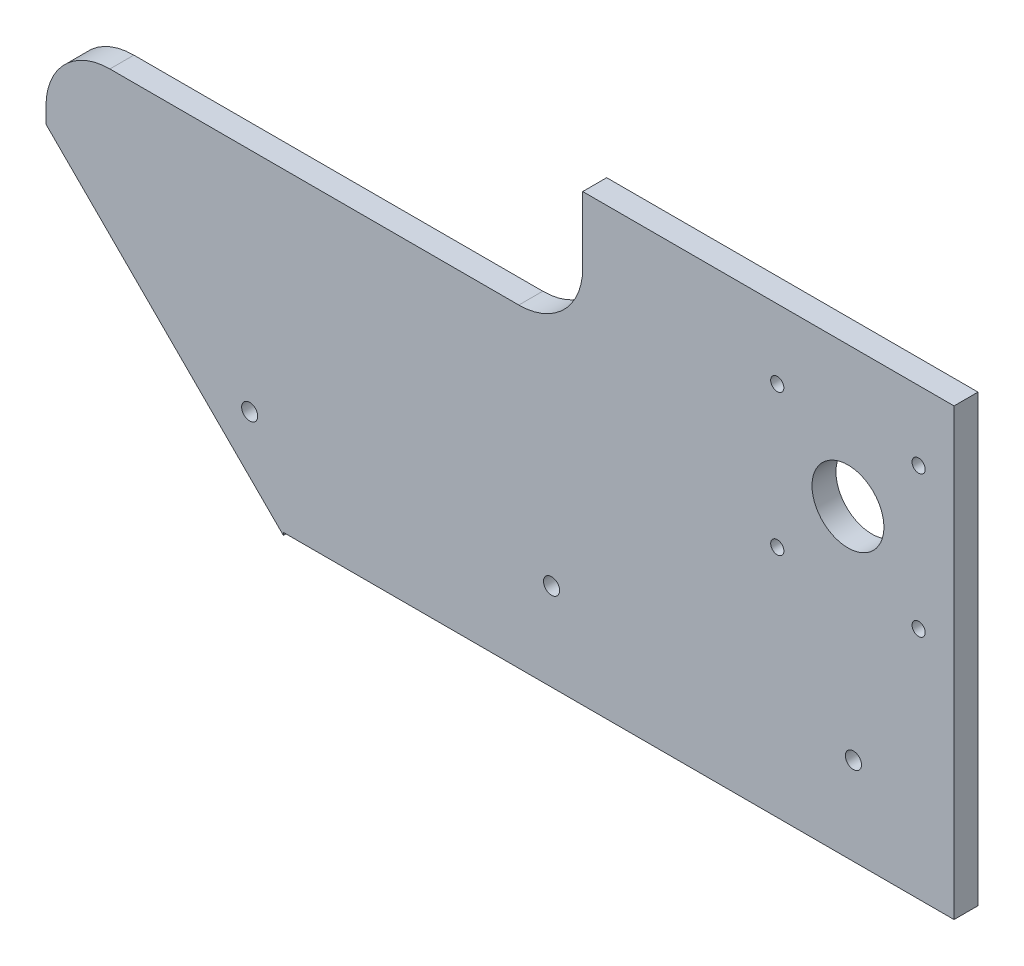
ISO-10303-21;
HEADER;
FILE_DESCRIPTION(('STEP AP214'),'2;1');
FILE_NAME('part.step','',(''),(''),'','','');
FILE_SCHEMA(('AUTOMOTIVE_DESIGN { 1 0 10303 214 1 1 1 1 }'));
ENDSEC;
DATA;
#1=APPLICATION_CONTEXT('core data for automotive mechanical design processes');
#2=APPLICATION_PROTOCOL_DEFINITION('international standard','automotive_design',2000,#1);
#3=PRODUCT_CONTEXT('',#1,'mechanical');
#4=PRODUCT('Part','Part','',(#3));
#5=PRODUCT_RELATED_PRODUCT_CATEGORY('part','',(#4));
#6=PRODUCT_DEFINITION_FORMATION('','',#4);
#7=PRODUCT_DEFINITION_CONTEXT('part definition',#1,'design');
#8=PRODUCT_DEFINITION('design','',#6,#7);
#9=PRODUCT_DEFINITION_SHAPE('','',#8);
#10=(LENGTH_UNIT() NAMED_UNIT(*) SI_UNIT(.MILLI.,.METRE.));
#11=(NAMED_UNIT(*) PLANE_ANGLE_UNIT() SI_UNIT($,.RADIAN.));
#12=(NAMED_UNIT(*) SI_UNIT($,.STERADIAN.) SOLID_ANGLE_UNIT());
#13=UNCERTAINTY_MEASURE_WITH_UNIT(LENGTH_MEASURE(1.E-05),#10,'distance_accuracy_value','');
#14=(GEOMETRIC_REPRESENTATION_CONTEXT(3) GLOBAL_UNCERTAINTY_ASSIGNED_CONTEXT((#13)) GLOBAL_UNIT_ASSIGNED_CONTEXT((#10,
#11,#12)) REPRESENTATION_CONTEXT('',''));
#15=CARTESIAN_POINT('',(0.,0.,0.));
#16=DIRECTION('',(0.,0.,1.));
#17=DIRECTION('',(1.,0.,0.));
#18=AXIS2_PLACEMENT_3D('',#15,#16,#17);
#19=CARTESIAN_POINT('',(0.,0.,9.525));
#20=DIRECTION('',(0.,0.,-1.));
#21=DIRECTION('',(-1.,0.,0.));
#22=AXIS2_PLACEMENT_3D('',#19,#20,#21);
#23=PLANE('',#22);
#24=CARTESIAN_POINT('',(-57.289372205593,-9.46452425694516,9.525));
#25=DIRECTION('',(0.,0.,1.));
#26=DIRECTION('',(1.,0.,0.));
#27=AXIS2_PLACEMENT_3D('',#24,#25,#26);
#28=CIRCLE('',#27,3.2);
#29=CARTESIAN_POINT('',(-54.089372205593,-9.46452425694516,9.525));
#30=VERTEX_POINT('',#29);
#31=EDGE_CURVE('E303',#30,#30,#28,.T.);
#32=ORIENTED_EDGE('',*,*,#31,.F.);
#33=EDGE_LOOP('',(#32));
#34=FACE_BOUND('',#33,.T.);
#35=CARTESIAN_POINT('',(62.710627794407,-9.46452425694516,9.525));
#36=DIRECTION('',(0.,0.,1.));
#37=DIRECTION('',(1.,0.,0.));
#38=AXIS2_PLACEMENT_3D('',#35,#36,#37);
#39=CIRCLE('',#38,3.19999999999999);
#40=CARTESIAN_POINT('',(65.910627794407,-9.46452425694516,9.525));
#41=VERTEX_POINT('',#40);
#42=EDGE_CURVE('E305',#41,#41,#39,.T.);
#43=ORIENTED_EDGE('',*,*,#42,.F.);
#44=EDGE_LOOP('',(#43));
#45=FACE_BOUND('',#44,.T.);
#46=CARTESIAN_POINT('',(182.710627794407,-9.46452425694516,9.525));
#47=DIRECTION('',(0.,0.,1.));
#48=DIRECTION('',(1.,0.,0.));
#49=AXIS2_PLACEMENT_3D('',#46,#47,#48);
#50=CIRCLE('',#49,3.20000000000001);
#51=CARTESIAN_POINT('',(185.910627794407,-9.46452425694516,9.525));
#52=VERTEX_POINT('',#51);
#53=EDGE_CURVE('E313',#52,#52,#50,.T.);
#54=ORIENTED_EDGE('',*,*,#53,.F.);
#55=EDGE_LOOP('',(#54));
#56=FACE_BOUND('',#55,.T.);
#57=CARTESIAN_POINT('',(208.638014077675,104.931975743054,9.525));
#58=DIRECTION('',(0.,0.,1.));
#59=DIRECTION('',(1.,0.,0.));
#60=AXIS2_PLACEMENT_3D('',#57,#58,#59);
#61=CIRCLE('',#60,2.62499999999999);
#62=CARTESIAN_POINT('',(211.263014077675,104.931975743054,9.525));
#63=VERTEX_POINT('',#62);
#64=EDGE_CURVE('E319',#63,#63,#61,.T.);
#65=ORIENTED_EDGE('',*,*,#64,.F.);
#66=EDGE_LOOP('',(#65));
#67=FACE_BOUND('',#66,.T.);
#68=CARTESIAN_POINT('',(152.438014077675,104.931975743054,9.525));
#69=DIRECTION('',(0.,0.,1.));
#70=DIRECTION('',(1.,0.,0.));
#71=AXIS2_PLACEMENT_3D('',#68,#69,#70);
#72=CIRCLE('',#71,2.62499999999999);
#73=CARTESIAN_POINT('',(155.063014077675,104.931975743054,9.525));
#74=VERTEX_POINT('',#73);
#75=EDGE_CURVE('E325',#74,#74,#72,.T.);
#76=ORIENTED_EDGE('',*,*,#75,.F.);
#77=EDGE_LOOP('',(#76));
#78=FACE_BOUND('',#77,.T.);
#79=CARTESIAN_POINT('',(152.438014077675,48.7319757430537,9.525));
#80=DIRECTION('',(0.,0.,1.));
#81=DIRECTION('',(1.,0.,0.));
#82=AXIS2_PLACEMENT_3D('',#79,#80,#81);
#83=CIRCLE('',#82,2.62499999999999);
#84=CARTESIAN_POINT('',(155.063014077675,48.7319757430537,9.525));
#85=VERTEX_POINT('',#84);
#86=EDGE_CURVE('E331',#85,#85,#83,.T.);
#87=ORIENTED_EDGE('',*,*,#86,.F.);
#88=EDGE_LOOP('',(#87));
#89=FACE_BOUND('',#88,.T.);
#90=CARTESIAN_POINT('',(208.638014077675,48.7319757430537,9.525));
#91=DIRECTION('',(0.,0.,1.));
#92=DIRECTION('',(1.,0.,0.));
#93=AXIS2_PLACEMENT_3D('',#90,#91,#92);
#94=CIRCLE('',#93,2.62499999999999);
#95=CARTESIAN_POINT('',(211.263014077675,48.7319757430537,9.525));
#96=VERTEX_POINT('',#95);
#97=EDGE_CURVE('E258',#96,#96,#94,.T.);
#98=ORIENTED_EDGE('',*,*,#97,.F.);
#99=EDGE_LOOP('',(#98));
#100=FACE_BOUND('',#99,.T.);
#101=CARTESIAN_POINT('',(180.538014077675,76.8319757430537,9.525));
#102=DIRECTION('',(0.,0.,1.));
#103=DIRECTION('',(1.,0.,0.));
#104=AXIS2_PLACEMENT_3D('',#101,#102,#103);
#105=CIRCLE('',#104,14.2875);
#106=CARTESIAN_POINT('',(166.250514077675,76.8319757430537,9.525));
#107=VERTEX_POINT('',#106);
#108=EDGE_CURVE('E145',#107,#107,#105,.T.);
#109=ORIENTED_EDGE('',*,*,#108,.F.);
#110=EDGE_LOOP('',(#109));
#111=FACE_BOUND('',#110,.T.);
#112=DIRECTION('',(0.,1.,0.));
#113=VECTOR('',#112,1.);
#114=CARTESIAN_POINT('',(222.710627804405,-121.478524256948,9.525));
#115=LINE('',#114,#113);
#116=CARTESIAN_POINT('',(222.710627804405,-44.3221747391824,9.525));
#117=VERTEX_POINT('',#116);
#118=CARTESIAN_POINT('',(222.710627804405,132.521475743053,9.525));
#119=VERTEX_POINT('',#118);
#120=EDGE_CURVE('E122',#117,#119,#115,.T.);
#121=ORIENTED_EDGE('',*,*,#120,.T.);
#122=DIRECTION('',(-1.,0.,0.));
#123=VECTOR('',#122,1.);
#124=CARTESIAN_POINT('',(75.1006165261018,132.521475743053,9.525));
#125=LINE('',#124,#123);
#126=CARTESIAN_POINT('',(75.1006165261018,132.521475743053,9.525));
#127=VERTEX_POINT('',#126);
#128=EDGE_CURVE('E108',#119,#127,#125,.T.);
#129=ORIENTED_EDGE('',*,*,#128,.T.);
#130=DIRECTION('',(0.,-1.,0.));
#131=VECTOR('',#130,1.);
#132=CARTESIAN_POINT('',(75.1006165261018,146.206839025053,9.525));
#133=LINE('',#132,#131);
#134=CARTESIAN_POINT('',(75.1006165261018,106.141487021357,9.525));
#135=VERTEX_POINT('',#134);
#136=EDGE_CURVE('E169',#127,#135,#133,.T.);
#137=ORIENTED_EDGE('',*,*,#136,.T.);
#138=CARTESIAN_POINT('',(49.7006165261018,106.141487021357,9.525));
#139=DIRECTION('',(0.,0.,-1.));
#140=DIRECTION('',(-1.,0.,0.));
#141=AXIS2_PLACEMENT_3D('',#138,#139,#140);
#142=CIRCLE('',#141,25.4);
#143=CARTESIAN_POINT('',(49.7006165261019,80.7414870213568,9.525));
#144=VERTEX_POINT('',#143);
#145=EDGE_CURVE('E41',#135,#144,#142,.T.);
#146=ORIENTED_EDGE('',*,*,#145,.T.);
#147=DIRECTION('',(1.,0.,0.));
#148=VECTOR('',#147,1.);
#149=CARTESIAN_POINT('',(-138.259383473898,80.7414870213568,9.525));
#150=LINE('',#149,#148);
#151=CARTESIAN_POINT('',(-112.859383473898,80.7414870213568,9.525));
#152=VERTEX_POINT('',#151);
#153=EDGE_CURVE('E168',#152,#144,#150,.T.);
#154=ORIENTED_EDGE('',*,*,#153,.F.);
#155=CARTESIAN_POINT('',(-112.859383473898,55.3414870213568,9.525));
#156=DIRECTION('',(0.,0.,-1.));
#157=DIRECTION('',(-1.,0.,0.));
#158=AXIS2_PLACEMENT_3D('',#155,#156,#157);
#159=CIRCLE('',#158,25.4);
#160=CARTESIAN_POINT('',(-138.259383473898,55.3414870213568,9.525));
#161=VERTEX_POINT('',#160);
#162=EDGE_CURVE('E158',#152,#161,#159,.F.);
#163=ORIENTED_EDGE('',*,*,#162,.T.);
#164=DIRECTION('',(0.,-1.,0.));
#165=VECTOR('',#164,1.);
#166=CARTESIAN_POINT('',(-138.259383473898,146.206839025053,9.525));
#167=LINE('',#166,#165);
#168=CARTESIAN_POINT('',(-138.259383473898,48.9914870213571,9.525));
#169=VERTEX_POINT('',#168);
#170=EDGE_CURVE('E129',#161,#169,#167,.T.);
#171=ORIENTED_EDGE('',*,*,#170,.T.);
#172=DIRECTION('',(0.707106781186546,-0.707106781186549,0.));
#173=VECTOR('',#172,1.);
#174=CARTESIAN_POINT('',(-138.259383473898,48.9914870213571,9.525));
#175=LINE('',#174,#173);
#176=CARTESIAN_POINT('',(-43.8795997738897,-45.3882966786511,9.525));
#177=VERTEX_POINT('',#176);
#178=EDGE_CURVE('E132',#169,#177,#175,.T.);
#179=ORIENTED_EDGE('',*,*,#178,.T.);
#180=DIRECTION('',(0.,1.,0.));
#181=VECTOR('',#180,1.);
#182=CARTESIAN_POINT('',(-43.8795997738897,-121.478524256947,9.525));
#183=LINE('',#182,#181);
#184=CARTESIAN_POINT('',(-43.8795997738897,-44.3221747391824,9.525));
#185=VERTEX_POINT('',#184);
#186=EDGE_CURVE('E195',#177,#185,#183,.T.);
#187=ORIENTED_EDGE('',*,*,#186,.T.);
#188=DIRECTION('',(-1.,0.,0.));
#189=VECTOR('',#188,1.);
#190=CARTESIAN_POINT('',(241.760627804405,-44.3221747391824,9.525));
#191=LINE('',#190,#189);
#192=EDGE_CURVE('E128',#117,#185,#191,.T.);
#193=ORIENTED_EDGE('',*,*,#192,.F.);
#194=EDGE_LOOP('',(#121,#129,#137,#146,#154,#163,#171,#179,#187,#193));
#195=FACE_BOUND('',#194,.T.);
#196=ADVANCED_FACE('F33',(#34,#45,#56,#67,#78,#89,#100,#111,#195),#23,.F.);
#197=CARTESIAN_POINT('',(0.,0.,0.));
#198=DIRECTION('',(0.,0.,-1.));
#199=DIRECTION('',(-1.,0.,0.));
#200=AXIS2_PLACEMENT_3D('',#197,#198,#199);
#201=PLANE('',#200);
#202=CARTESIAN_POINT('',(-57.289372205593,-9.46452425694516,0.));
#203=DIRECTION('',(0.,0.,1.));
#204=DIRECTION('',(1.,0.,0.));
#205=AXIS2_PLACEMENT_3D('',#202,#203,#204);
#206=CIRCLE('',#205,3.19999999999999);
#207=CARTESIAN_POINT('',(-54.089372205593,-9.46452425694516,0.));
#208=VERTEX_POINT('',#207);
#209=EDGE_CURVE('E301',#208,#208,#206,.T.);
#210=ORIENTED_EDGE('',*,*,#209,.T.);
#211=EDGE_LOOP('',(#210));
#212=FACE_BOUND('',#211,.T.);
#213=CARTESIAN_POINT('',(62.710627794407,-9.46452425694516,0.));
#214=DIRECTION('',(0.,0.,1.));
#215=DIRECTION('',(1.,0.,0.));
#216=AXIS2_PLACEMENT_3D('',#213,#214,#215);
#217=CIRCLE('',#216,3.19999999999999);
#218=CARTESIAN_POINT('',(65.910627794407,-9.46452425694516,0.));
#219=VERTEX_POINT('',#218);
#220=EDGE_CURVE('E310',#219,#219,#217,.T.);
#221=ORIENTED_EDGE('',*,*,#220,.T.);
#222=EDGE_LOOP('',(#221));
#223=FACE_BOUND('',#222,.T.);
#224=CARTESIAN_POINT('',(182.710627794407,-9.46452425694516,0.));
#225=DIRECTION('',(0.,0.,1.));
#226=DIRECTION('',(1.,0.,0.));
#227=AXIS2_PLACEMENT_3D('',#224,#225,#226);
#228=CIRCLE('',#227,3.20000000000001);
#229=CARTESIAN_POINT('',(185.910627794407,-9.46452425694516,0.));
#230=VERTEX_POINT('',#229);
#231=EDGE_CURVE('E316',#230,#230,#228,.T.);
#232=ORIENTED_EDGE('',*,*,#231,.T.);
#233=EDGE_LOOP('',(#232));
#234=FACE_BOUND('',#233,.T.);
#235=CARTESIAN_POINT('',(208.638014077675,104.931975743054,0.));
#236=DIRECTION('',(0.,0.,1.));
#237=DIRECTION('',(1.,0.,0.));
#238=AXIS2_PLACEMENT_3D('',#235,#236,#237);
#239=CIRCLE('',#238,2.62499999999999);
#240=CARTESIAN_POINT('',(211.263014077675,104.931975743054,0.));
#241=VERTEX_POINT('',#240);
#242=EDGE_CURVE('E322',#241,#241,#239,.T.);
#243=ORIENTED_EDGE('',*,*,#242,.T.);
#244=EDGE_LOOP('',(#243));
#245=FACE_BOUND('',#244,.T.);
#246=CARTESIAN_POINT('',(152.438014077675,104.931975743054,0.));
#247=DIRECTION('',(0.,0.,1.));
#248=DIRECTION('',(1.,0.,0.));
#249=AXIS2_PLACEMENT_3D('',#246,#247,#248);
#250=CIRCLE('',#249,2.62499999999999);
#251=CARTESIAN_POINT('',(155.063014077675,104.931975743054,0.));
#252=VERTEX_POINT('',#251);
#253=EDGE_CURVE('E328',#252,#252,#250,.T.);
#254=ORIENTED_EDGE('',*,*,#253,.T.);
#255=EDGE_LOOP('',(#254));
#256=FACE_BOUND('',#255,.T.);
#257=CARTESIAN_POINT('',(152.438014077675,48.7319757430537,0.));
#258=DIRECTION('',(0.,0.,1.));
#259=DIRECTION('',(1.,0.,0.));
#260=AXIS2_PLACEMENT_3D('',#257,#258,#259);
#261=CIRCLE('',#260,2.62499999999999);
#262=CARTESIAN_POINT('',(155.063014077675,48.7319757430537,0.));
#263=VERTEX_POINT('',#262);
#264=EDGE_CURVE('E334',#263,#263,#261,.T.);
#265=ORIENTED_EDGE('',*,*,#264,.T.);
#266=EDGE_LOOP('',(#265));
#267=FACE_BOUND('',#266,.T.);
#268=CARTESIAN_POINT('',(208.638014077675,48.7319757430537,0.));
#269=DIRECTION('',(0.,0.,1.));
#270=DIRECTION('',(1.,0.,0.));
#271=AXIS2_PLACEMENT_3D('',#268,#269,#270);
#272=CIRCLE('',#271,2.62499999999999);
#273=CARTESIAN_POINT('',(211.263014077675,48.7319757430537,0.));
#274=VERTEX_POINT('',#273);
#275=EDGE_CURVE('E255',#274,#274,#272,.T.);
#276=ORIENTED_EDGE('',*,*,#275,.T.);
#277=EDGE_LOOP('',(#276));
#278=FACE_BOUND('',#277,.T.);
#279=DIRECTION('',(-1.,0.,0.));
#280=VECTOR('',#279,1.);
#281=CARTESIAN_POINT('',(75.1006165261018,132.521475743053,0.));
#282=LINE('',#281,#280);
#283=CARTESIAN_POINT('',(222.710627804405,132.521475743053,0.));
#284=VERTEX_POINT('',#283);
#285=CARTESIAN_POINT('',(75.1006165261018,132.521475743053,0.));
#286=VERTEX_POINT('',#285);
#287=EDGE_CURVE('E48',#284,#286,#282,.T.);
#288=ORIENTED_EDGE('',*,*,#287,.F.);
#289=DIRECTION('',(0.,1.,0.));
#290=VECTOR('',#289,1.);
#291=CARTESIAN_POINT('',(222.710627804405,-121.478524256948,0.));
#292=LINE('',#291,#290);
#293=CARTESIAN_POINT('',(222.710627804405,-44.3221747391824,0.));
#294=VERTEX_POINT('',#293);
#295=EDGE_CURVE('E124',#294,#284,#292,.T.);
#296=ORIENTED_EDGE('',*,*,#295,.F.);
#297=DIRECTION('',(-1.,0.,0.));
#298=VECTOR('',#297,1.);
#299=CARTESIAN_POINT('',(241.760627804405,-44.3221747391824,0.));
#300=LINE('',#299,#298);
#301=CARTESIAN_POINT('',(-43.8795997738897,-44.3221747391824,0.));
#302=VERTEX_POINT('',#301);
#303=EDGE_CURVE('E191',#294,#302,#300,.T.);
#304=ORIENTED_EDGE('',*,*,#303,.T.);
#305=DIRECTION('',(0.,1.,0.));
#306=VECTOR('',#305,1.);
#307=CARTESIAN_POINT('',(-43.8795997738897,-121.478524256947,0.));
#308=LINE('',#307,#306);
#309=CARTESIAN_POINT('',(-43.8795997738897,-45.3882966786512,0.));
#310=VERTEX_POINT('',#309);
#311=EDGE_CURVE('E194',#310,#302,#308,.T.);
#312=ORIENTED_EDGE('',*,*,#311,.F.);
#313=DIRECTION('',(0.707106781186546,-0.707106781186549,0.));
#314=VECTOR('',#313,1.);
#315=CARTESIAN_POINT('',(-138.259383473898,48.9914870213571,0.));
#316=LINE('',#315,#314);
#317=CARTESIAN_POINT('',(-138.259383473898,48.9914870213571,0.));
#318=VERTEX_POINT('',#317);
#319=EDGE_CURVE('E130',#318,#310,#316,.T.);
#320=ORIENTED_EDGE('',*,*,#319,.F.);
#321=DIRECTION('',(0.,-1.,0.));
#322=VECTOR('',#321,1.);
#323=CARTESIAN_POINT('',(-138.259383473898,146.206839025053,0.));
#324=LINE('',#323,#322);
#325=CARTESIAN_POINT('',(-138.259383473898,55.3414870213568,0.));
#326=VERTEX_POINT('',#325);
#327=EDGE_CURVE('E135',#326,#318,#324,.T.);
#328=ORIENTED_EDGE('',*,*,#327,.F.);
#329=CARTESIAN_POINT('',(-112.859383473898,55.3414870213568,0.));
#330=DIRECTION('',(0.,0.,-1.));
#331=DIRECTION('',(-1.,0.,0.));
#332=AXIS2_PLACEMENT_3D('',#329,#330,#331);
#333=CIRCLE('',#332,25.4);
#334=CARTESIAN_POINT('',(-112.859383473898,80.7414870213568,0.));
#335=VERTEX_POINT('',#334);
#336=EDGE_CURVE('E162',#326,#335,#333,.T.);
#337=ORIENTED_EDGE('',*,*,#336,.T.);
#338=DIRECTION('',(1.,0.,0.));
#339=VECTOR('',#338,1.);
#340=CARTESIAN_POINT('',(-138.259383473898,80.7414870213568,0.));
#341=LINE('',#340,#339);
#342=CARTESIAN_POINT('',(49.7006165261019,80.7414870213568,0.));
#343=VERTEX_POINT('',#342);
#344=EDGE_CURVE('E183',#335,#343,#341,.T.);
#345=ORIENTED_EDGE('',*,*,#344,.T.);
#346=CARTESIAN_POINT('',(49.7006165261018,106.141487021357,0.));
#347=DIRECTION('',(0.,0.,-1.));
#348=DIRECTION('',(-1.,0.,0.));
#349=AXIS2_PLACEMENT_3D('',#346,#347,#348);
#350=CIRCLE('',#349,25.4);
#351=CARTESIAN_POINT('',(75.1006165261018,106.141487021357,0.));
#352=VERTEX_POINT('',#351);
#353=EDGE_CURVE('E11',#343,#352,#350,.F.);
#354=ORIENTED_EDGE('',*,*,#353,.T.);
#355=DIRECTION('',(0.,-1.,0.));
#356=VECTOR('',#355,1.);
#357=CARTESIAN_POINT('',(75.1006165261018,146.206839025053,0.));
#358=LINE('',#357,#356);
#359=EDGE_CURVE('E55',#286,#352,#358,.T.);
#360=ORIENTED_EDGE('',*,*,#359,.F.);
#361=EDGE_LOOP('',(#288,#296,#304,#312,#320,#328,#337,#345,#354,#360));
#362=FACE_BOUND('',#361,.T.);
#363=CARTESIAN_POINT('',(180.538014077675,76.8319757430537,0.));
#364=DIRECTION('',(0.,0.,1.));
#365=DIRECTION('',(1.,0.,0.));
#366=AXIS2_PLACEMENT_3D('',#363,#364,#365);
#367=CIRCLE('',#366,14.2875);
#368=CARTESIAN_POINT('',(166.250514077675,76.8319757430537,0.));
#369=VERTEX_POINT('',#368);
#370=EDGE_CURVE('E138',#369,#369,#367,.T.);
#371=ORIENTED_EDGE('',*,*,#370,.T.);
#372=EDGE_LOOP('',(#371));
#373=FACE_BOUND('',#372,.T.);
#374=ADVANCED_FACE('F181',(#212,#223,#234,#245,#256,#267,#278,#362,#373),#201,.T.);
#375=CARTESIAN_POINT('',(-138.259383473898,48.9914870213571,9.525));
#376=DIRECTION('',(0.707106781186549,0.707106781186546,0.));
#377=DIRECTION('',(-0.707106781186546,0.707106781186549,0.));
#378=AXIS2_PLACEMENT_3D('',#375,#376,#377);
#379=PLANE('',#378);
#380=DIRECTION('',(0.,0.,-1.));
#381=VECTOR('',#380,1.);
#382=CARTESIAN_POINT('',(-43.8795997738897,-45.3882966786511,9.525));
#383=LINE('',#382,#381);
#384=EDGE_CURVE('E149',#177,#310,#383,.T.);
#385=ORIENTED_EDGE('',*,*,#384,.F.);
#386=ORIENTED_EDGE('',*,*,#178,.F.);
#387=DIRECTION('',(0.,0.,-1.));
#388=VECTOR('',#387,1.);
#389=CARTESIAN_POINT('',(-138.259383473898,48.9914870213571,9.525));
#390=LINE('',#389,#388);
#391=EDGE_CURVE('E143',#169,#318,#390,.T.);
#392=ORIENTED_EDGE('',*,*,#391,.T.);
#393=ORIENTED_EDGE('',*,*,#319,.T.);
#394=EDGE_LOOP('',(#385,#386,#392,#393));
#395=FACE_BOUND('',#394,.T.);
#396=ADVANCED_FACE('F227',(#395),#379,.F.);
#397=CARTESIAN_POINT('',(222.710627804405,-121.478524256948,9.525));
#398=DIRECTION('',(-1.,0.,0.));
#399=DIRECTION('',(0.,-1.,0.));
#400=AXIS2_PLACEMENT_3D('',#397,#398,#399);
#401=PLANE('',#400);
#402=ORIENTED_EDGE('',*,*,#295,.T.);
#403=DIRECTION('',(0.,0.,-1.));
#404=VECTOR('',#403,1.);
#405=CARTESIAN_POINT('',(222.710627804405,132.521475743053,9.525));
#406=LINE('',#405,#404);
#407=EDGE_CURVE('E111',#119,#284,#406,.T.);
#408=ORIENTED_EDGE('',*,*,#407,.F.);
#409=ORIENTED_EDGE('',*,*,#120,.F.);
#410=DIRECTION('',(0.,0.,-1.));
#411=VECTOR('',#410,1.);
#412=CARTESIAN_POINT('',(222.710627804405,-44.3221747391824,9.525));
#413=LINE('',#412,#411);
#414=EDGE_CURVE('E151',#117,#294,#413,.T.);
#415=ORIENTED_EDGE('',*,*,#414,.T.);
#416=EDGE_LOOP('',(#402,#408,#409,#415));
#417=FACE_BOUND('',#416,.T.);
#418=ADVANCED_FACE('F120',(#417),#401,.F.);
#419=CARTESIAN_POINT('',(-138.259383473898,146.206839025053,9.525));
#420=DIRECTION('',(1.,0.,0.));
#421=DIRECTION('',(0.,0.,-1.));
#422=AXIS2_PLACEMENT_3D('',#419,#420,#421);
#423=PLANE('',#422);
#424=ORIENTED_EDGE('',*,*,#170,.F.);
#425=DIRECTION('',(0.,0.,1.));
#426=VECTOR('',#425,1.);
#427=CARTESIAN_POINT('',(-138.259383473898,55.3414870213568,9.525));
#428=LINE('',#427,#426);
#429=EDGE_CURVE('E160',#161,#326,#428,.F.);
#430=ORIENTED_EDGE('',*,*,#429,.T.);
#431=ORIENTED_EDGE('',*,*,#327,.T.);
#432=ORIENTED_EDGE('',*,*,#391,.F.);
#433=EDGE_LOOP('',(#424,#430,#431,#432));
#434=FACE_BOUND('',#433,.T.);
#435=ADVANCED_FACE('F210',(#434),#423,.F.);
#436=CARTESIAN_POINT('',(180.538014077675,76.8319757430537,9.525));
#437=DIRECTION('',(0.,0.,-1.));
#438=DIRECTION('',(-1.,0.,0.));
#439=AXIS2_PLACEMENT_3D('',#436,#437,#438);
#440=CYLINDRICAL_SURFACE('',#439,14.2875);
#441=CARTESIAN_POINT('',(166.250514077675,76.8319757430537,9.525));
#442=CARTESIAN_POINT('',(166.250514077675,76.8319757430537,9.42578125));
#443=CARTESIAN_POINT('',(166.250514077675,76.8319757430537,9.3265625));
#444=CARTESIAN_POINT('',(166.250514077675,76.8319757430537,9.128125));
#445=CARTESIAN_POINT('',(166.250514077675,76.8319757430537,9.02890625));
#446=CARTESIAN_POINT('',(166.250514077675,76.8319757430537,8.83046875));
#447=CARTESIAN_POINT('',(166.250514077675,76.8319757430537,8.73125));
#448=CARTESIAN_POINT('',(166.250514077675,76.8319757430537,8.5328125));
#449=CARTESIAN_POINT('',(166.250514077675,76.8319757430537,8.43359375));
#450=CARTESIAN_POINT('',(166.250514077675,76.8319757430537,8.23515625));
#451=CARTESIAN_POINT('',(166.250514077675,76.8319757430537,8.1359375));
#452=CARTESIAN_POINT('',(166.250514077675,76.8319757430537,7.9375));
#453=CARTESIAN_POINT('',(166.250514077675,76.8319757430537,7.83828125));
#454=CARTESIAN_POINT('',(166.250514077675,76.8319757430537,7.63984375));
#455=CARTESIAN_POINT('',(166.250514077675,76.8319757430537,7.540625));
#456=CARTESIAN_POINT('',(166.250514077675,76.8319757430537,7.3421875));
#457=CARTESIAN_POINT('',(166.250514077675,76.8319757430537,7.24296875));
#458=CARTESIAN_POINT('',(166.250514077675,76.8319757430537,7.04453125));
#459=CARTESIAN_POINT('',(166.250514077675,76.8319757430537,6.9453125));
#460=CARTESIAN_POINT('',(166.250514077675,76.8319757430537,6.746875));
#461=CARTESIAN_POINT('',(166.250514077675,76.8319757430537,6.64765625));
#462=CARTESIAN_POINT('',(166.250514077675,76.8319757430537,6.44921875));
#463=CARTESIAN_POINT('',(166.250514077675,76.8319757430537,6.35));
#464=CARTESIAN_POINT('',(166.250514077675,76.8319757430537,6.1515625));
#465=CARTESIAN_POINT('',(166.250514077675,76.8319757430537,6.05234375));
#466=CARTESIAN_POINT('',(166.250514077675,76.8319757430537,5.85390625));
#467=CARTESIAN_POINT('',(166.250514077675,76.8319757430537,5.7546875));
#468=CARTESIAN_POINT('',(166.250514077675,76.8319757430537,5.55625));
#469=CARTESIAN_POINT('',(166.250514077675,76.8319757430537,5.45703125));
#470=CARTESIAN_POINT('',(166.250514077675,76.8319757430537,5.25859375));
#471=CARTESIAN_POINT('',(166.250514077675,76.8319757430537,5.159375));
#472=CARTESIAN_POINT('',(166.250514077675,76.8319757430537,4.9609375));
#473=CARTESIAN_POINT('',(166.250514077675,76.8319757430537,4.86171875));
#474=CARTESIAN_POINT('',(166.250514077675,76.8319757430537,4.66328125));
#475=CARTESIAN_POINT('',(166.250514077675,76.8319757430537,4.5640625));
#476=CARTESIAN_POINT('',(166.250514077675,76.8319757430537,4.365625));
#477=CARTESIAN_POINT('',(166.250514077675,76.8319757430537,4.26640625));
#478=CARTESIAN_POINT('',(166.250514077675,76.8319757430537,4.06796875));
#479=CARTESIAN_POINT('',(166.250514077675,76.8319757430537,3.96875));
#480=CARTESIAN_POINT('',(166.250514077675,76.8319757430537,3.7703125));
#481=CARTESIAN_POINT('',(166.250514077675,76.8319757430537,3.67109375));
#482=CARTESIAN_POINT('',(166.250514077675,76.8319757430537,3.47265625));
#483=CARTESIAN_POINT('',(166.250514077675,76.8319757430537,3.3734375));
#484=CARTESIAN_POINT('',(166.250514077675,76.8319757430537,3.175));
#485=CARTESIAN_POINT('',(166.250514077675,76.8319757430537,3.07578125));
#486=CARTESIAN_POINT('',(166.250514077675,76.8319757430537,2.87734375));
#487=CARTESIAN_POINT('',(166.250514077675,76.8319757430537,2.778125));
#488=CARTESIAN_POINT('',(166.250514077675,76.8319757430537,2.5796875));
#489=CARTESIAN_POINT('',(166.250514077675,76.8319757430537,2.48046875));
#490=CARTESIAN_POINT('',(166.250514077675,76.8319757430537,2.28203125));
#491=CARTESIAN_POINT('',(166.250514077675,76.8319757430537,2.1828125));
#492=CARTESIAN_POINT('',(166.250514077675,76.8319757430537,1.984375));
#493=CARTESIAN_POINT('',(166.250514077675,76.8319757430537,1.88515625));
#494=CARTESIAN_POINT('',(166.250514077675,76.8319757430537,1.68671875));
#495=CARTESIAN_POINT('',(166.250514077675,76.8319757430537,1.5875));
#496=CARTESIAN_POINT('',(166.250514077675,76.8319757430537,1.3890625));
#497=CARTESIAN_POINT('',(166.250514077675,76.8319757430537,1.28984375));
#498=CARTESIAN_POINT('',(166.250514077675,76.8319757430537,1.09140625));
#499=CARTESIAN_POINT('',(166.250514077675,76.8319757430537,0.992187500000001));
#500=CARTESIAN_POINT('',(166.250514077675,76.8319757430537,0.793750000000001));
#501=CARTESIAN_POINT('',(166.250514077675,76.8319757430537,0.69453125));
#502=CARTESIAN_POINT('',(166.250514077675,76.8319757430537,0.49609375));
#503=CARTESIAN_POINT('',(166.250514077675,76.8319757430537,0.396875));
#504=CARTESIAN_POINT('',(166.250514077675,76.8319757430537,0.1984375));
#505=CARTESIAN_POINT('',(166.250514077675,76.8319757430537,0.0992187500000001));
#506=CARTESIAN_POINT('',(166.250514077675,76.8319757430537,0.));
#507=B_SPLINE_CURVE_WITH_KNOTS('',3,(#441,#442,#443,#444,#445,#446,#447,#448,#449,#450,#451,
#452,#453,#454,#455,#456,#457,#458,#459,#460,#461,#462,#463,#464,#465,#466,#467,#468,#469,#470,
#471,#472,#473,#474,#475,#476,#477,#478,#479,#480,#481,#482,#483,#484,#485,#486,#487,#488,#489,
#490,#491,#492,#493,#494,#495,#496,#497,#498,#499,#500,#501,#502,#503,#504,#505,#506),
.UNSPECIFIED.,.F.,.F.,(4,2,2,2,2,2,2,2,2,2,2,2,2,2,2,2,2,2,2,2,2,2,2,2,2,2,2,2,2,2,2,2,4),(0.,
0.29765625,0.5953125,0.892968750000001,1.190625,1.48828125,1.7859375,2.08359375,2.38125,
2.67890625,2.9765625,3.27421875,3.571875,3.86953125,4.1671875,4.46484375,4.7625,5.06015625,
5.3578125,5.65546875,5.953125,6.25078125,6.5484375,6.84609375,7.14375,7.44140625,7.7390625,
8.03671875,8.334375,8.63203125,8.9296875,9.22734375,9.525),.UNSPECIFIED.);
#508=EDGE_CURVE('BSEAM207',#107,#369,#507,.T.);
#509=ORIENTED_EDGE('',*,*,#108,.T.);
#510=ORIENTED_EDGE('',*,*,#370,.F.);
#511=ORIENTED_EDGE('',*,*,#508,.T.);
#512=ORIENTED_EDGE('',*,*,#508,.F.);
#513=EDGE_LOOP('',(#509,#511,#510,#512));
#514=FACE_BOUND('',#513,.T.);
#515=ADVANCED_FACE('F207',(#514),#440,.F.);
#516=CARTESIAN_POINT('',(241.760627804405,-44.3221747391824,0.));
#517=DIRECTION('',(0.,1.,0.));
#518=DIRECTION('',(-1.,0.,0.));
#519=AXIS2_PLACEMENT_3D('',#516,#517,#518);
#520=PLANE('',#519);
#521=ORIENTED_EDGE('',*,*,#192,.T.);
#522=DIRECTION('',(0.,0.,1.));
#523=VECTOR('',#522,1.);
#524=CARTESIAN_POINT('',(-43.8795997738897,-44.3221747391824,0.));
#525=LINE('',#524,#523);
#526=EDGE_CURVE('E197',#302,#185,#525,.T.);
#527=ORIENTED_EDGE('',*,*,#526,.F.);
#528=ORIENTED_EDGE('',*,*,#303,.F.);
#529=ORIENTED_EDGE('',*,*,#414,.F.);
#530=EDGE_LOOP('',(#521,#527,#528,#529));
#531=FACE_BOUND('',#530,.T.);
#532=ADVANCED_FACE('F209',(#531),#520,.F.);
#533=CARTESIAN_POINT('',(-43.8795997738897,-121.478524256947,0.));
#534=DIRECTION('',(1.,0.,0.));
#535=DIRECTION('',(0.,0.,-1.));
#536=AXIS2_PLACEMENT_3D('',#533,#534,#535);
#537=PLANE('',#536);
#538=ORIENTED_EDGE('',*,*,#384,.T.);
#539=ORIENTED_EDGE('',*,*,#311,.T.);
#540=ORIENTED_EDGE('',*,*,#526,.T.);
#541=ORIENTED_EDGE('',*,*,#186,.F.);
#542=EDGE_LOOP('',(#538,#539,#540,#541));
#543=FACE_BOUND('',#542,.T.);
#544=ADVANCED_FACE('F216',(#543),#537,.T.);
#545=CARTESIAN_POINT('',(75.1006165261018,146.206839025053,0.));
#546=DIRECTION('',(-1.,0.,0.));
#547=DIRECTION('',(0.,0.,1.));
#548=AXIS2_PLACEMENT_3D('',#545,#546,#547);
#549=PLANE('',#548);
#550=DIRECTION('',(0.,0.,-1.));
#551=VECTOR('',#550,1.);
#552=CARTESIAN_POINT('',(75.1006165261018,132.521475743053,9.525));
#553=LINE('',#552,#551);
#554=EDGE_CURVE('E112',#127,#286,#553,.T.);
#555=ORIENTED_EDGE('',*,*,#554,.T.);
#556=ORIENTED_EDGE('',*,*,#359,.T.);
#557=DIRECTION('',(0.,0.,1.));
#558=VECTOR('',#557,1.);
#559=CARTESIAN_POINT('',(75.1006165261018,106.141487021357,0.));
#560=LINE('',#559,#558);
#561=EDGE_CURVE('E164',#352,#135,#560,.T.);
#562=ORIENTED_EDGE('',*,*,#561,.T.);
#563=ORIENTED_EDGE('',*,*,#136,.F.);
#564=EDGE_LOOP('',(#555,#556,#562,#563));
#565=FACE_BOUND('',#564,.T.);
#566=ADVANCED_FACE('F244',(#565),#549,.T.);
#567=CARTESIAN_POINT('',(-138.259383473898,80.7414870213568,0.));
#568=DIRECTION('',(0.,-1.,0.));
#569=DIRECTION('',(0.,0.,-1.));
#570=AXIS2_PLACEMENT_3D('',#567,#568,#569);
#571=PLANE('',#570);
#572=ORIENTED_EDGE('',*,*,#344,.F.);
#573=DIRECTION('',(0.,0.,1.));
#574=VECTOR('',#573,1.);
#575=CARTESIAN_POINT('',(-112.859383473898,80.7414870213568,0.));
#576=LINE('',#575,#574);
#577=EDGE_CURVE('E155',#335,#152,#576,.T.);
#578=ORIENTED_EDGE('',*,*,#577,.T.);
#579=ORIENTED_EDGE('',*,*,#153,.T.);
#580=DIRECTION('',(0.,0.,1.));
#581=VECTOR('',#580,1.);
#582=CARTESIAN_POINT('',(49.7006165261019,80.7414870213568,0.));
#583=LINE('',#582,#581);
#584=EDGE_CURVE('E153',#144,#343,#583,.F.);
#585=ORIENTED_EDGE('',*,*,#584,.T.);
#586=EDGE_LOOP('',(#572,#578,#579,#585));
#587=FACE_BOUND('',#586,.T.);
#588=ADVANCED_FACE('F175',(#587),#571,.F.);
#589=CARTESIAN_POINT('',(-112.859383473898,55.3414870213568,0.));
#590=DIRECTION('',(0.,0.,1.));
#591=DIRECTION('',(1.,0.,0.));
#592=AXIS2_PLACEMENT_3D('',#589,#590,#591);
#593=CYLINDRICAL_SURFACE('',#592,25.4);
#594=ORIENTED_EDGE('',*,*,#336,.F.);
#595=ORIENTED_EDGE('',*,*,#429,.F.);
#596=ORIENTED_EDGE('',*,*,#162,.F.);
#597=ORIENTED_EDGE('',*,*,#577,.F.);
#598=EDGE_LOOP('',(#594,#595,#596,#597));
#599=FACE_BOUND('',#598,.T.);
#600=ADVANCED_FACE('F237',(#599),#593,.T.);
#601=CARTESIAN_POINT('',(49.7006165261018,106.141487021357,0.));
#602=DIRECTION('',(0.,0.,1.));
#603=DIRECTION('',(1.,0.,0.));
#604=AXIS2_PLACEMENT_3D('',#601,#602,#603);
#605=CYLINDRICAL_SURFACE('',#604,25.4);
#606=ORIENTED_EDGE('',*,*,#353,.F.);
#607=ORIENTED_EDGE('',*,*,#584,.F.);
#608=ORIENTED_EDGE('',*,*,#145,.F.);
#609=ORIENTED_EDGE('',*,*,#561,.F.);
#610=EDGE_LOOP('',(#606,#607,#608,#609));
#611=FACE_BOUND('',#610,.T.);
#612=ADVANCED_FACE('F35',(#611),#605,.F.);
#613=CARTESIAN_POINT('',(75.1006165261018,132.521475743053,9.525));
#614=DIRECTION('',(0.,-1.,0.));
#615=DIRECTION('',(0.,0.,-1.));
#616=AXIS2_PLACEMENT_3D('',#613,#614,#615);
#617=PLANE('',#616);
#618=ORIENTED_EDGE('',*,*,#287,.T.);
#619=ORIENTED_EDGE('',*,*,#554,.F.);
#620=ORIENTED_EDGE('',*,*,#128,.F.);
#621=ORIENTED_EDGE('',*,*,#407,.T.);
#622=EDGE_LOOP('',(#618,#619,#620,#621));
#623=FACE_BOUND('',#622,.T.);
#624=ADVANCED_FACE('F110',(#623),#617,.F.);
#625=CARTESIAN_POINT('',(208.638014077675,48.7319757430537,9.525));
#626=DIRECTION('',(0.,0.,1.));
#627=DIRECTION('',(1.,0.,0.));
#628=AXIS2_PLACEMENT_3D('',#625,#626,#627);
#629=CYLINDRICAL_SURFACE('',#628,2.62499999999999);
#630=ORIENTED_EDGE('',*,*,#275,.F.);
#631=EDGE_LOOP('',(#630));
#632=FACE_BOUND('',#631,.T.);
#633=ORIENTED_EDGE('',*,*,#97,.T.);
#634=EDGE_LOOP('',(#633));
#635=FACE_BOUND('',#634,.T.);
#636=ADVANCED_FACE('F269',(#632,#635),#629,.F.);
#637=CARTESIAN_POINT('',(152.438014077675,48.7319757430537,9.525));
#638=DIRECTION('',(0.,0.,1.));
#639=DIRECTION('',(1.,0.,0.));
#640=AXIS2_PLACEMENT_3D('',#637,#638,#639);
#641=CYLINDRICAL_SURFACE('',#640,2.62499999999999);
#642=ORIENTED_EDGE('',*,*,#264,.F.);
#643=EDGE_LOOP('',(#642));
#644=FACE_BOUND('',#643,.T.);
#645=ORIENTED_EDGE('',*,*,#86,.T.);
#646=EDGE_LOOP('',(#645));
#647=FACE_BOUND('',#646,.T.);
#648=ADVANCED_FACE('F272',(#644,#647),#641,.F.);
#649=CARTESIAN_POINT('',(152.438014077675,104.931975743054,9.525));
#650=DIRECTION('',(0.,0.,1.));
#651=DIRECTION('',(1.,0.,0.));
#652=AXIS2_PLACEMENT_3D('',#649,#650,#651);
#653=CYLINDRICAL_SURFACE('',#652,2.62499999999999);
#654=ORIENTED_EDGE('',*,*,#253,.F.);
#655=EDGE_LOOP('',(#654));
#656=FACE_BOUND('',#655,.T.);
#657=ORIENTED_EDGE('',*,*,#75,.T.);
#658=EDGE_LOOP('',(#657));
#659=FACE_BOUND('',#658,.T.);
#660=ADVANCED_FACE('F276',(#656,#659),#653,.F.);
#661=CARTESIAN_POINT('',(208.638014077675,104.931975743054,9.525));
#662=DIRECTION('',(0.,0.,1.));
#663=DIRECTION('',(1.,0.,0.));
#664=AXIS2_PLACEMENT_3D('',#661,#662,#663);
#665=CYLINDRICAL_SURFACE('',#664,2.62499999999999);
#666=ORIENTED_EDGE('',*,*,#242,.F.);
#667=EDGE_LOOP('',(#666));
#668=FACE_BOUND('',#667,.T.);
#669=ORIENTED_EDGE('',*,*,#64,.T.);
#670=EDGE_LOOP('',(#669));
#671=FACE_BOUND('',#670,.T.);
#672=ADVANCED_FACE('F280',(#668,#671),#665,.F.);
#673=CARTESIAN_POINT('',(182.710627794407,-9.46452425694516,9.525));
#674=DIRECTION('',(0.,0.,1.));
#675=DIRECTION('',(1.,0.,0.));
#676=AXIS2_PLACEMENT_3D('',#673,#674,#675);
#677=CYLINDRICAL_SURFACE('',#676,3.20000000000001);
#678=ORIENTED_EDGE('',*,*,#231,.F.);
#679=EDGE_LOOP('',(#678));
#680=FACE_BOUND('',#679,.T.);
#681=ORIENTED_EDGE('',*,*,#53,.T.);
#682=EDGE_LOOP('',(#681));
#683=FACE_BOUND('',#682,.T.);
#684=ADVANCED_FACE('F284',(#680,#683),#677,.F.);
#685=CARTESIAN_POINT('',(62.710627794407,-9.46452425694516,9.525));
#686=DIRECTION('',(0.,0.,1.));
#687=DIRECTION('',(1.,0.,0.));
#688=AXIS2_PLACEMENT_3D('',#685,#686,#687);
#689=CYLINDRICAL_SURFACE('',#688,3.19999999999999);
#690=ORIENTED_EDGE('',*,*,#220,.F.);
#691=EDGE_LOOP('',(#690));
#692=FACE_BOUND('',#691,.T.);
#693=ORIENTED_EDGE('',*,*,#42,.T.);
#694=EDGE_LOOP('',(#693));
#695=FACE_BOUND('',#694,.T.);
#696=ADVANCED_FACE('F288',(#692,#695),#689,.F.);
#697=CARTESIAN_POINT('',(-57.289372205593,-9.46452425694516,9.525));
#698=DIRECTION('',(0.,0.,1.));
#699=DIRECTION('',(1.,0.,0.));
#700=AXIS2_PLACEMENT_3D('',#697,#698,#699);
#701=CYLINDRICAL_SURFACE('',#700,3.2);
#702=ORIENTED_EDGE('',*,*,#209,.F.);
#703=EDGE_LOOP('',(#702));
#704=FACE_BOUND('',#703,.T.);
#705=ORIENTED_EDGE('',*,*,#31,.T.);
#706=EDGE_LOOP('',(#705));
#707=FACE_BOUND('',#706,.T.);
#708=ADVANCED_FACE('F292',(#704,#707),#701,.F.);
#709=CLOSED_SHELL('',(#196,#374,#396,#418,#435,#515,#532,#544,#566,#588,#600,#612,#624,#636,
#648,#660,#672,#684,#696,#708));
#710=MANIFOLD_SOLID_BREP('B2',#709);
#711=ADVANCED_BREP_SHAPE_REPRESENTATION('',(#18,#710),#14);
#712=SHAPE_DEFINITION_REPRESENTATION(#9,#711);
ENDSEC;
END-ISO-10303-21;
